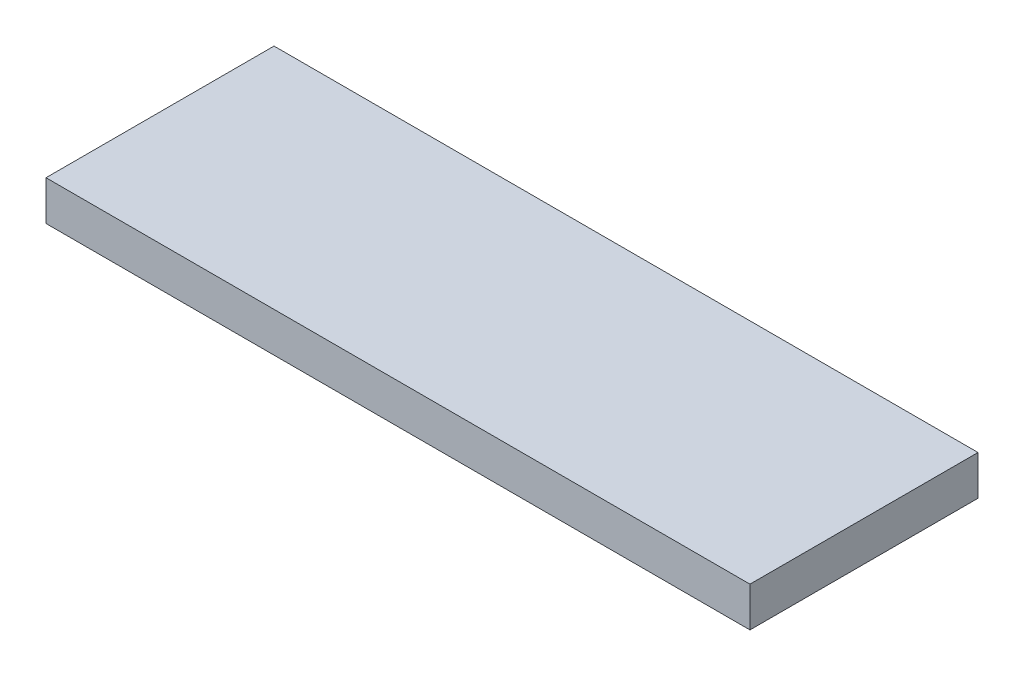
ISO-10303-21;
HEADER;
FILE_DESCRIPTION(('STEP AP214'),'2;1');
FILE_NAME('part.step','',(''),(''),'','','');
FILE_SCHEMA(('AUTOMOTIVE_DESIGN { 1 0 10303 214 1 1 1 1 }'));
ENDSEC;
DATA;
#1=APPLICATION_CONTEXT('core data for automotive mechanical design processes');
#2=APPLICATION_PROTOCOL_DEFINITION('international standard','automotive_design',2000,#1);
#3=PRODUCT_CONTEXT('',#1,'mechanical');
#4=PRODUCT('Part','Part','',(#3));
#5=PRODUCT_RELATED_PRODUCT_CATEGORY('part','',(#4));
#6=PRODUCT_DEFINITION_FORMATION('','',#4);
#7=PRODUCT_DEFINITION_CONTEXT('part definition',#1,'design');
#8=PRODUCT_DEFINITION('design','',#6,#7);
#9=PRODUCT_DEFINITION_SHAPE('','',#8);
#10=(LENGTH_UNIT() NAMED_UNIT(*) SI_UNIT(.MILLI.,.METRE.));
#11=(NAMED_UNIT(*) PLANE_ANGLE_UNIT() SI_UNIT($,.RADIAN.));
#12=(NAMED_UNIT(*) SI_UNIT($,.STERADIAN.) SOLID_ANGLE_UNIT());
#13=UNCERTAINTY_MEASURE_WITH_UNIT(LENGTH_MEASURE(1.E-05),#10,'distance_accuracy_value','');
#14=(GEOMETRIC_REPRESENTATION_CONTEXT(3) GLOBAL_UNCERTAINTY_ASSIGNED_CONTEXT((#13)) GLOBAL_UNIT_ASSIGNED_CONTEXT((#10,
#11,#12)) REPRESENTATION_CONTEXT('',''));
#15=CARTESIAN_POINT('',(0.,0.,0.));
#16=DIRECTION('',(0.,0.,1.));
#17=DIRECTION('',(1.,0.,0.));
#18=AXIS2_PLACEMENT_3D('',#15,#16,#17);
#19=CARTESIAN_POINT('',(-189.638221153846,11.,-55.5372596153846));
#20=DIRECTION('',(1.,0.,0.));
#21=DIRECTION('',(0.,0.,-1.));
#22=AXIS2_PLACEMENT_3D('',#19,#20,#21);
#23=PLANE('',#22);
#24=DIRECTION('',(0.,0.,1.));
#25=VECTOR('',#24,1.);
#26=CARTESIAN_POINT('',(-189.638221153846,-9.,-55.5372596153846));
#27=LINE('',#26,#25);
#28=CARTESIAN_POINT('',(-189.638221153846,-9.,-55.5372596153846));
#29=VERTEX_POINT('',#28);
#30=CARTESIAN_POINT('',(-189.638221153846,-9.,59.4627403846154));
#31=VERTEX_POINT('',#30);
#32=EDGE_CURVE('E102',#29,#31,#27,.T.);
#33=ORIENTED_EDGE('',*,*,#32,.T.);
#34=DIRECTION('',(0.,-1.,0.));
#35=VECTOR('',#34,1.);
#36=CARTESIAN_POINT('',(-189.638221153846,11.,59.4627403846154));
#37=LINE('',#36,#35);
#38=CARTESIAN_POINT('',(-189.638221153846,11.,59.4627403846154));
#39=VERTEX_POINT('',#38);
#40=EDGE_CURVE('E11',#39,#31,#37,.T.);
#41=ORIENTED_EDGE('',*,*,#40,.F.);
#42=DIRECTION('',(0.,0.,1.));
#43=VECTOR('',#42,1.);
#44=CARTESIAN_POINT('',(-189.638221153846,11.,-55.5372596153846));
#45=LINE('',#44,#43);
#46=CARTESIAN_POINT('',(-189.638221153846,11.,-55.5372596153846));
#47=VERTEX_POINT('',#46);
#48=EDGE_CURVE('E90',#47,#39,#45,.T.);
#49=ORIENTED_EDGE('',*,*,#48,.F.);
#50=DIRECTION('',(0.,-1.,0.));
#51=VECTOR('',#50,1.);
#52=CARTESIAN_POINT('',(-189.638221153846,11.,-55.5372596153846));
#53=LINE('',#52,#51);
#54=EDGE_CURVE('E98',#47,#29,#53,.T.);
#55=ORIENTED_EDGE('',*,*,#54,.T.);
#56=EDGE_LOOP('',(#33,#41,#49,#55));
#57=FACE_BOUND('',#56,.T.);
#58=ADVANCED_FACE('F39',(#57),#23,.F.);
#59=CARTESIAN_POINT('',(-189.638221153846,11.,59.4627403846154));
#60=DIRECTION('',(0.,0.,-1.));
#61=DIRECTION('',(-1.,0.,0.));
#62=AXIS2_PLACEMENT_3D('',#59,#60,#61);
#63=PLANE('',#62);
#64=DIRECTION('',(1.,0.,0.));
#65=VECTOR('',#64,1.);
#66=CARTESIAN_POINT('',(-189.638221153846,-9.,59.4627403846154));
#67=LINE('',#66,#65);
#68=CARTESIAN_POINT('',(165.361778846154,-9.,59.4627403846154));
#69=VERTEX_POINT('',#68);
#70=EDGE_CURVE('E94',#31,#69,#67,.T.);
#71=ORIENTED_EDGE('',*,*,#70,.T.);
#72=DIRECTION('',(0.,-1.,0.));
#73=VECTOR('',#72,1.);
#74=CARTESIAN_POINT('',(165.361778846154,11.,59.4627403846154));
#75=LINE('',#74,#73);
#76=CARTESIAN_POINT('',(165.361778846154,11.,59.4627403846154));
#77=VERTEX_POINT('',#76);
#78=EDGE_CURVE('E47',#77,#69,#75,.T.);
#79=ORIENTED_EDGE('',*,*,#78,.F.);
#80=DIRECTION('',(1.,0.,0.));
#81=VECTOR('',#80,1.);
#82=CARTESIAN_POINT('',(-189.638221153846,11.,59.4627403846154));
#83=LINE('',#82,#81);
#84=EDGE_CURVE('E85',#39,#77,#83,.T.);
#85=ORIENTED_EDGE('',*,*,#84,.F.);
#86=ORIENTED_EDGE('',*,*,#40,.T.);
#87=EDGE_LOOP('',(#71,#79,#85,#86));
#88=FACE_BOUND('',#87,.T.);
#89=ADVANCED_FACE('F93',(#88),#63,.F.);
#90=CARTESIAN_POINT('',(165.361778846154,11.,-55.5372596153846));
#91=DIRECTION('',(-1.,0.,0.));
#92=DIRECTION('',(0.,0.,1.));
#93=AXIS2_PLACEMENT_3D('',#90,#91,#92);
#94=PLANE('',#93);
#95=DIRECTION('',(0.,0.,-1.));
#96=VECTOR('',#95,1.);
#97=CARTESIAN_POINT('',(165.361778846154,-9.,-55.5372596153846));
#98=LINE('',#97,#96);
#99=CARTESIAN_POINT('',(165.361778846154,-9.,-55.5372596153846));
#100=VERTEX_POINT('',#99);
#101=EDGE_CURVE('E72',#69,#100,#98,.T.);
#102=ORIENTED_EDGE('',*,*,#101,.T.);
#103=DIRECTION('',(0.,-1.,0.));
#104=VECTOR('',#103,1.);
#105=CARTESIAN_POINT('',(165.361778846154,11.,-55.5372596153846));
#106=LINE('',#105,#104);
#107=CARTESIAN_POINT('',(165.361778846154,11.,-55.5372596153846));
#108=VERTEX_POINT('',#107);
#109=EDGE_CURVE('E95',#108,#100,#106,.T.);
#110=ORIENTED_EDGE('',*,*,#109,.F.);
#111=DIRECTION('',(0.,0.,-1.));
#112=VECTOR('',#111,1.);
#113=CARTESIAN_POINT('',(165.361778846154,11.,-55.5372596153846));
#114=LINE('',#113,#112);
#115=EDGE_CURVE('E88',#77,#108,#114,.T.);
#116=ORIENTED_EDGE('',*,*,#115,.F.);
#117=ORIENTED_EDGE('',*,*,#78,.T.);
#118=EDGE_LOOP('',(#102,#110,#116,#117));
#119=FACE_BOUND('',#118,.T.);
#120=ADVANCED_FACE('F96',(#119),#94,.F.);
#121=CARTESIAN_POINT('',(-189.638221153846,11.,-55.5372596153846));
#122=DIRECTION('',(0.,0.,1.));
#123=DIRECTION('',(1.,0.,0.));
#124=AXIS2_PLACEMENT_3D('',#121,#122,#123);
#125=PLANE('',#124);
#126=DIRECTION('',(-1.,0.,0.));
#127=VECTOR('',#126,1.);
#128=CARTESIAN_POINT('',(-189.638221153846,-9.,-55.5372596153846));
#129=LINE('',#128,#127);
#130=EDGE_CURVE('E78',#100,#29,#129,.T.);
#131=ORIENTED_EDGE('',*,*,#130,.T.);
#132=ORIENTED_EDGE('',*,*,#54,.F.);
#133=DIRECTION('',(-1.,0.,0.));
#134=VECTOR('',#133,1.);
#135=CARTESIAN_POINT('',(-189.638221153846,11.,-55.5372596153846));
#136=LINE('',#135,#134);
#137=EDGE_CURVE('E55',#108,#47,#136,.T.);
#138=ORIENTED_EDGE('',*,*,#137,.F.);
#139=ORIENTED_EDGE('',*,*,#109,.T.);
#140=EDGE_LOOP('',(#131,#132,#138,#139));
#141=FACE_BOUND('',#140,.T.);
#142=ADVANCED_FACE('F109',(#141),#125,.F.);
#143=CARTESIAN_POINT('',(109.243990384615,11.,-17.6646634615385));
#144=DIRECTION('',(0.,1.,0.));
#145=DIRECTION('',(0.,0.,1.));
#146=AXIS2_PLACEMENT_3D('',#143,#144,#145);
#147=PLANE('',#146);
#148=ORIENTED_EDGE('',*,*,#48,.T.);
#149=ORIENTED_EDGE('',*,*,#84,.T.);
#150=ORIENTED_EDGE('',*,*,#115,.T.);
#151=ORIENTED_EDGE('',*,*,#137,.T.);
#152=EDGE_LOOP('',(#148,#149,#150,#151));
#153=FACE_BOUND('',#152,.T.);
#154=ADVANCED_FACE('F86',(#153),#147,.T.);
#155=CARTESIAN_POINT('',(109.243990384615,-9.,-17.6646634615385));
#156=DIRECTION('',(0.,1.,0.));
#157=DIRECTION('',(0.,0.,1.));
#158=AXIS2_PLACEMENT_3D('',#155,#156,#157);
#159=PLANE('',#158);
#160=ORIENTED_EDGE('',*,*,#32,.F.);
#161=ORIENTED_EDGE('',*,*,#130,.F.);
#162=ORIENTED_EDGE('',*,*,#101,.F.);
#163=ORIENTED_EDGE('',*,*,#70,.F.);
#164=EDGE_LOOP('',(#160,#161,#162,#163));
#165=FACE_BOUND('',#164,.T.);
#166=ADVANCED_FACE('F112',(#165),#159,.F.);
#167=CLOSED_SHELL('',(#58,#89,#120,#142,#154,#166));
#168=MANIFOLD_SOLID_BREP('B2',#167);
#169=ADVANCED_BREP_SHAPE_REPRESENTATION('',(#18,#168),#14);
#170=SHAPE_DEFINITION_REPRESENTATION(#9,#169);
ENDSEC;
END-ISO-10303-21;
